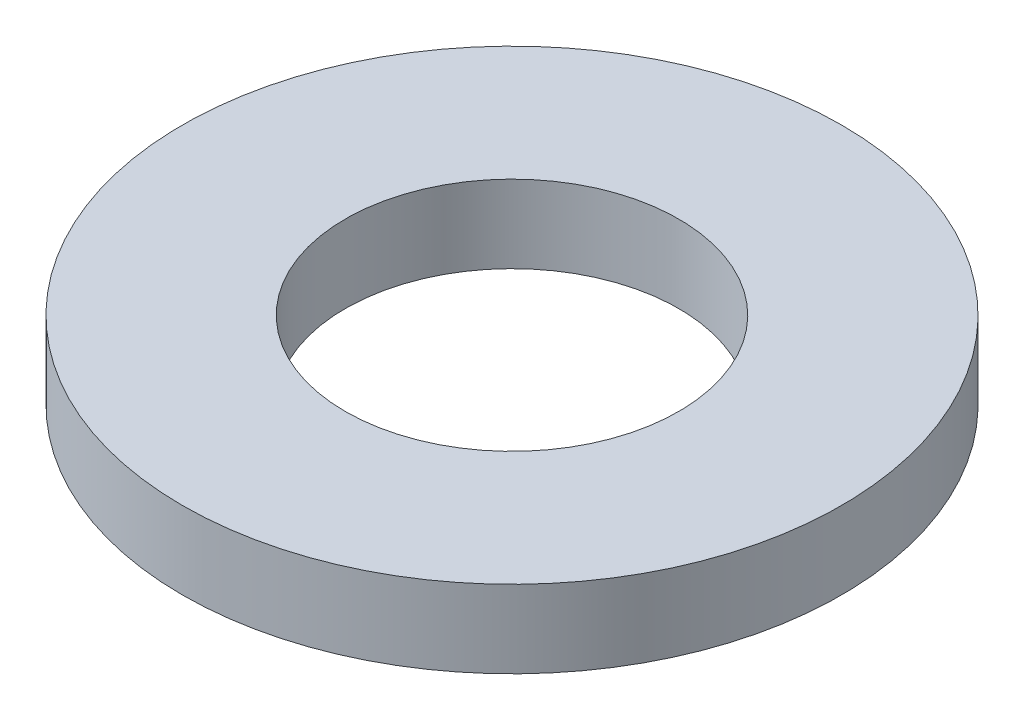
ISO-10303-21;
HEADER;
FILE_DESCRIPTION(('STEP AP214'),'2;1');
FILE_NAME('part.step','',(''),(''),'','','');
FILE_SCHEMA(('AUTOMOTIVE_DESIGN { 1 0 10303 214 1 1 1 1 }'));
ENDSEC;
DATA;
#1=APPLICATION_CONTEXT('core data for automotive mechanical design processes');
#2=APPLICATION_PROTOCOL_DEFINITION('international standard','automotive_design',2000,#1);
#3=PRODUCT_CONTEXT('',#1,'mechanical');
#4=PRODUCT('Part','Part','',(#3));
#5=PRODUCT_RELATED_PRODUCT_CATEGORY('part','',(#4));
#6=PRODUCT_DEFINITION_FORMATION('','',#4);
#7=PRODUCT_DEFINITION_CONTEXT('part definition',#1,'design');
#8=PRODUCT_DEFINITION('design','',#6,#7);
#9=PRODUCT_DEFINITION_SHAPE('','',#8);
#10=(LENGTH_UNIT() NAMED_UNIT(*) SI_UNIT(.MILLI.,.METRE.));
#11=(NAMED_UNIT(*) PLANE_ANGLE_UNIT() SI_UNIT($,.RADIAN.));
#12=(NAMED_UNIT(*) SI_UNIT($,.STERADIAN.) SOLID_ANGLE_UNIT());
#13=UNCERTAINTY_MEASURE_WITH_UNIT(LENGTH_MEASURE(1.E-05),#10,'distance_accuracy_value','');
#14=(GEOMETRIC_REPRESENTATION_CONTEXT(3) GLOBAL_UNCERTAINTY_ASSIGNED_CONTEXT((#13)) GLOBAL_UNIT_ASSIGNED_CONTEXT((#10,
#11,#12)) REPRESENTATION_CONTEXT('',''));
#15=CARTESIAN_POINT('',(0.,0.,0.));
#16=DIRECTION('',(0.,0.,1.));
#17=DIRECTION('',(1.,0.,0.));
#18=AXIS2_PLACEMENT_3D('',#15,#16,#17);
#19=CARTESIAN_POINT('',(0.,1.,0.));
#20=DIRECTION('',(0.,1.,0.));
#21=DIRECTION('',(0.,0.,1.));
#22=AXIS2_PLACEMENT_3D('',#19,#20,#21);
#23=PLANE('',#22);
#24=CARTESIAN_POINT('',(0.,1.,0.));
#25=DIRECTION('',(0.,1.,0.));
#26=DIRECTION('',(0.,0.,1.));
#27=AXIS2_PLACEMENT_3D('',#24,#25,#26);
#28=CIRCLE('',#27,4.25);
#29=CARTESIAN_POINT('',(0.,1.,4.25));
#30=VERTEX_POINT('',#29);
#31=EDGE_CURVE('E10',#30,#30,#28,.T.);
#32=ORIENTED_EDGE('',*,*,#31,.T.);
#33=EDGE_LOOP('',(#32));
#34=FACE_BOUND('',#33,.T.);
#35=CARTESIAN_POINT('',(0.,1.,0.));
#36=DIRECTION('',(0.,1.,0.));
#37=DIRECTION('',(0.,0.,1.));
#38=AXIS2_PLACEMENT_3D('',#35,#36,#37);
#39=CIRCLE('',#38,2.15);
#40=CARTESIAN_POINT('',(0.,1.,2.15));
#41=VERTEX_POINT('',#40);
#42=EDGE_CURVE('E44',#41,#41,#39,.T.);
#43=ORIENTED_EDGE('',*,*,#42,.F.);
#44=EDGE_LOOP('',(#43));
#45=FACE_BOUND('',#44,.T.);
#46=ADVANCED_FACE('F33',(#34,#45),#23,.T.);
#47=CARTESIAN_POINT('',(0.,0.,0.));
#48=DIRECTION('',(0.,1.,0.));
#49=DIRECTION('',(0.,0.,1.));
#50=AXIS2_PLACEMENT_3D('',#47,#48,#49);
#51=PLANE('',#50);
#52=CARTESIAN_POINT('',(0.,0.,0.));
#53=DIRECTION('',(0.,1.,0.));
#54=DIRECTION('',(0.,0.,1.));
#55=AXIS2_PLACEMENT_3D('',#52,#53,#54);
#56=CIRCLE('',#55,4.25);
#57=CARTESIAN_POINT('',(0.,0.,4.25));
#58=VERTEX_POINT('',#57);
#59=EDGE_CURVE('E37',#58,#58,#56,.T.);
#60=ORIENTED_EDGE('',*,*,#59,.F.);
#61=EDGE_LOOP('',(#60));
#62=FACE_BOUND('',#61,.T.);
#63=CARTESIAN_POINT('',(0.,0.,0.));
#64=DIRECTION('',(0.,1.,0.));
#65=DIRECTION('',(0.,0.,1.));
#66=AXIS2_PLACEMENT_3D('',#63,#64,#65);
#67=CIRCLE('',#66,2.15);
#68=CARTESIAN_POINT('',(0.,0.,2.15));
#69=VERTEX_POINT('',#68);
#70=EDGE_CURVE('E46',#69,#69,#67,.T.);
#71=ORIENTED_EDGE('',*,*,#70,.T.);
#72=EDGE_LOOP('',(#71));
#73=FACE_BOUND('',#72,.T.);
#74=ADVANCED_FACE('F56',(#62,#73),#51,.F.);
#75=CARTESIAN_POINT('',(0.,1.,0.));
#76=DIRECTION('',(0.,-1.,0.));
#77=DIRECTION('',(0.,0.,-1.));
#78=AXIS2_PLACEMENT_3D('',#75,#76,#77);
#79=CYLINDRICAL_SURFACE('',#78,4.25);
#80=ORIENTED_EDGE('',*,*,#31,.F.);
#81=EDGE_LOOP('',(#80));
#82=FACE_BOUND('',#81,.T.);
#83=ORIENTED_EDGE('',*,*,#59,.T.);
#84=EDGE_LOOP('',(#83));
#85=FACE_BOUND('',#84,.T.);
#86=ADVANCED_FACE('F35',(#82,#85),#79,.T.);
#87=CARTESIAN_POINT('',(0.,1.,0.));
#88=DIRECTION('',(0.,-1.,0.));
#89=DIRECTION('',(0.,0.,-1.));
#90=AXIS2_PLACEMENT_3D('',#87,#88,#89);
#91=CYLINDRICAL_SURFACE('',#90,2.15);
#92=ORIENTED_EDGE('',*,*,#42,.T.);
#93=EDGE_LOOP('',(#92));
#94=FACE_BOUND('',#93,.T.);
#95=ORIENTED_EDGE('',*,*,#70,.F.);
#96=EDGE_LOOP('',(#95));
#97=FACE_BOUND('',#96,.T.);
#98=ADVANCED_FACE('F52',(#94,#97),#91,.F.);
#99=CLOSED_SHELL('',(#46,#74,#86,#98));
#100=MANIFOLD_SOLID_BREP('B2',#99);
#101=ADVANCED_BREP_SHAPE_REPRESENTATION('',(#18,#100),#14);
#102=SHAPE_DEFINITION_REPRESENTATION(#9,#101);
ENDSEC;
END-ISO-10303-21;
